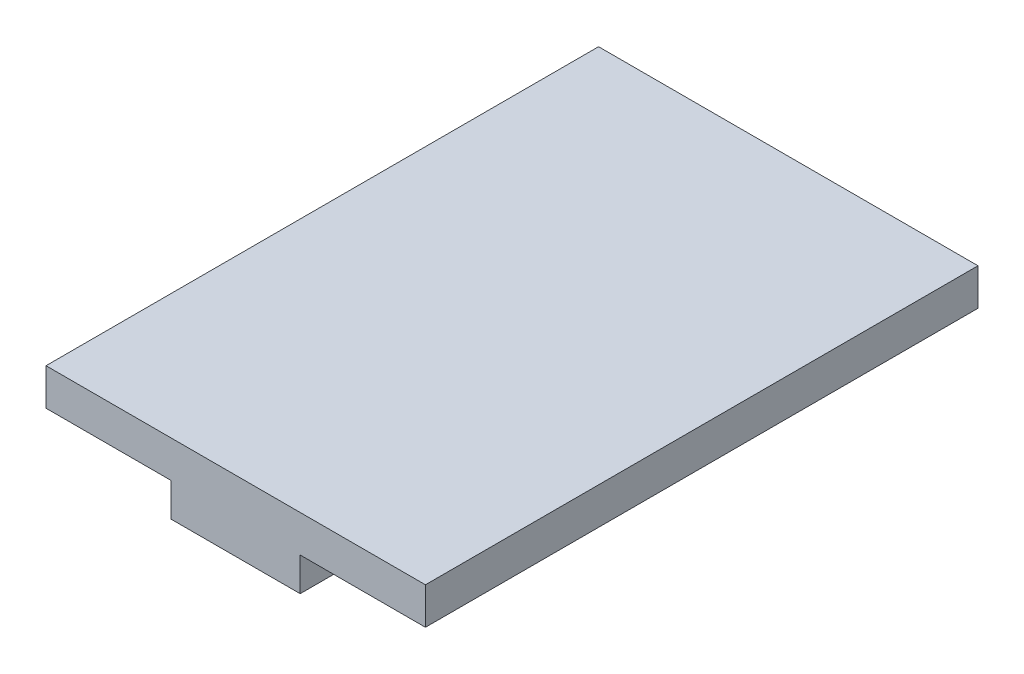
ISO-10303-21;
HEADER;
FILE_DESCRIPTION(('STEP AP214'),'2;1');
FILE_NAME('part.step','',(''),(''),'','','');
FILE_SCHEMA(('AUTOMOTIVE_DESIGN { 1 0 10303 214 1 1 1 1 }'));
ENDSEC;
DATA;
#1=APPLICATION_CONTEXT('core data for automotive mechanical design processes');
#2=APPLICATION_PROTOCOL_DEFINITION('international standard','automotive_design',2000,#1);
#3=PRODUCT_CONTEXT('',#1,'mechanical');
#4=PRODUCT('Part','Part','',(#3));
#5=PRODUCT_RELATED_PRODUCT_CATEGORY('part','',(#4));
#6=PRODUCT_DEFINITION_FORMATION('','',#4);
#7=PRODUCT_DEFINITION_CONTEXT('part definition',#1,'design');
#8=PRODUCT_DEFINITION('design','',#6,#7);
#9=PRODUCT_DEFINITION_SHAPE('','',#8);
#10=(LENGTH_UNIT() NAMED_UNIT(*) SI_UNIT(.MILLI.,.METRE.));
#11=(NAMED_UNIT(*) PLANE_ANGLE_UNIT() SI_UNIT($,.RADIAN.));
#12=(NAMED_UNIT(*) SI_UNIT($,.STERADIAN.) SOLID_ANGLE_UNIT());
#13=UNCERTAINTY_MEASURE_WITH_UNIT(LENGTH_MEASURE(1.E-05),#10,'distance_accuracy_value','');
#14=(GEOMETRIC_REPRESENTATION_CONTEXT(3) GLOBAL_UNCERTAINTY_ASSIGNED_CONTEXT((#13)) GLOBAL_UNIT_ASSIGNED_CONTEXT((#10,
#11,#12)) REPRESENTATION_CONTEXT('',''));
#15=CARTESIAN_POINT('',(0.,0.,0.));
#16=DIRECTION('',(0.,0.,1.));
#17=DIRECTION('',(1.,0.,0.));
#18=AXIS2_PLACEMENT_3D('',#15,#16,#17);
#19=CARTESIAN_POINT('',(-10.3,2.,-30.));
#20=DIRECTION('',(-1.,0.,0.));
#21=DIRECTION('',(0.,0.,1.));
#22=AXIS2_PLACEMENT_3D('',#19,#20,#21);
#23=PLANE('',#22);
#24=DIRECTION('',(0.,-1.,0.));
#25=VECTOR('',#24,1.);
#26=CARTESIAN_POINT('',(-10.3,2.,0.));
#27=LINE('',#26,#25);
#28=CARTESIAN_POINT('',(-10.3,2.,0.));
#29=VERTEX_POINT('',#28);
#30=CARTESIAN_POINT('',(-10.3,0.,0.));
#31=VERTEX_POINT('',#30);
#32=EDGE_CURVE('E138',#29,#31,#27,.T.);
#33=ORIENTED_EDGE('',*,*,#32,.F.);
#34=DIRECTION('',(0.,0.,1.));
#35=VECTOR('',#34,1.);
#36=CARTESIAN_POINT('',(-10.3,2.,-30.));
#37=LINE('',#36,#35);
#38=CARTESIAN_POINT('',(-10.3,2.,-30.));
#39=VERTEX_POINT('',#38);
#40=EDGE_CURVE('E11',#39,#29,#37,.T.);
#41=ORIENTED_EDGE('',*,*,#40,.F.);
#42=DIRECTION('',(0.,-1.,0.));
#43=VECTOR('',#42,1.);
#44=CARTESIAN_POINT('',(-10.3,2.,-30.));
#45=LINE('',#44,#43);
#46=CARTESIAN_POINT('',(-10.3,0.,-30.));
#47=VERTEX_POINT('',#46);
#48=EDGE_CURVE('E142',#39,#47,#45,.T.);
#49=ORIENTED_EDGE('',*,*,#48,.T.);
#50=DIRECTION('',(0.,0.,1.));
#51=VECTOR('',#50,1.);
#52=CARTESIAN_POINT('',(-10.3,0.,-30.));
#53=LINE('',#52,#51);
#54=EDGE_CURVE('E38',#47,#31,#53,.T.);
#55=ORIENTED_EDGE('',*,*,#54,.T.);
#56=EDGE_LOOP('',(#33,#41,#49,#55));
#57=FACE_BOUND('',#56,.T.);
#58=ADVANCED_FACE('F35',(#57),#23,.T.);
#59=CARTESIAN_POINT('',(-10.3,2.,-30.));
#60=DIRECTION('',(0.,1.,0.));
#61=DIRECTION('',(-1.,0.,0.));
#62=AXIS2_PLACEMENT_3D('',#59,#60,#61);
#63=PLANE('',#62);
#64=DIRECTION('',(-1.,0.,0.));
#65=VECTOR('',#64,1.);
#66=CARTESIAN_POINT('',(-10.3,2.,0.));
#67=LINE('',#66,#65);
#68=CARTESIAN_POINT('',(10.3,2.,0.));
#69=VERTEX_POINT('',#68);
#70=EDGE_CURVE('E145',#69,#29,#67,.T.);
#71=ORIENTED_EDGE('',*,*,#70,.F.);
#72=DIRECTION('',(0.,0.,1.));
#73=VECTOR('',#72,1.);
#74=CARTESIAN_POINT('',(10.3,2.,-30.));
#75=LINE('',#74,#73);
#76=CARTESIAN_POINT('',(10.3,2.,-30.));
#77=VERTEX_POINT('',#76);
#78=EDGE_CURVE('E43',#77,#69,#75,.T.);
#79=ORIENTED_EDGE('',*,*,#78,.F.);
#80=DIRECTION('',(-1.,0.,0.));
#81=VECTOR('',#80,1.);
#82=CARTESIAN_POINT('',(-10.3,2.,-30.));
#83=LINE('',#82,#81);
#84=EDGE_CURVE('E150',#77,#39,#83,.T.);
#85=ORIENTED_EDGE('',*,*,#84,.T.);
#86=ORIENTED_EDGE('',*,*,#40,.T.);
#87=EDGE_LOOP('',(#71,#79,#85,#86));
#88=FACE_BOUND('',#87,.T.);
#89=ADVANCED_FACE('F171',(#88),#63,.T.);
#90=CARTESIAN_POINT('',(10.3,2.,-30.));
#91=DIRECTION('',(1.,0.,0.));
#92=DIRECTION('',(0.,0.,-1.));
#93=AXIS2_PLACEMENT_3D('',#90,#91,#92);
#94=PLANE('',#93);
#95=DIRECTION('',(0.,1.,0.));
#96=VECTOR('',#95,1.);
#97=CARTESIAN_POINT('',(10.3,2.,0.));
#98=LINE('',#97,#96);
#99=CARTESIAN_POINT('',(10.3,0.,0.));
#100=VERTEX_POINT('',#99);
#101=EDGE_CURVE('E158',#100,#69,#98,.T.);
#102=ORIENTED_EDGE('',*,*,#101,.F.);
#103=DIRECTION('',(0.,0.,1.));
#104=VECTOR('',#103,1.);
#105=CARTESIAN_POINT('',(10.3,0.,-30.));
#106=LINE('',#105,#104);
#107=CARTESIAN_POINT('',(10.3,0.,-30.));
#108=VERTEX_POINT('',#107);
#109=EDGE_CURVE('E163',#108,#100,#106,.T.);
#110=ORIENTED_EDGE('',*,*,#109,.F.);
#111=DIRECTION('',(0.,1.,0.));
#112=VECTOR('',#111,1.);
#113=CARTESIAN_POINT('',(10.3,2.,-30.));
#114=LINE('',#113,#112);
#115=EDGE_CURVE('E147',#108,#77,#114,.T.);
#116=ORIENTED_EDGE('',*,*,#115,.T.);
#117=ORIENTED_EDGE('',*,*,#78,.T.);
#118=EDGE_LOOP('',(#102,#110,#116,#117));
#119=FACE_BOUND('',#118,.T.);
#120=ADVANCED_FACE('F175',(#119),#94,.T.);
#121=CARTESIAN_POINT('',(-10.3,0.,-30.));
#122=DIRECTION('',(0.,-1.,0.));
#123=DIRECTION('',(1.,0.,0.));
#124=AXIS2_PLACEMENT_3D('',#121,#122,#123);
#125=PLANE('',#124);
#126=DIRECTION('',(0.,0.,1.));
#127=VECTOR('',#126,1.);
#128=CARTESIAN_POINT('',(3.5,0.,-10.));
#129=LINE('',#128,#127);
#130=CARTESIAN_POINT('',(3.5,0.,-10.));
#131=VERTEX_POINT('',#130);
#132=CARTESIAN_POINT('',(3.5,0.,0.));
#133=VERTEX_POINT('',#132);
#134=EDGE_CURVE('E139',#131,#133,#129,.T.);
#135=ORIENTED_EDGE('',*,*,#134,.F.);
#136=DIRECTION('',(-1.,0.,0.));
#137=VECTOR('',#136,1.);
#138=CARTESIAN_POINT('',(-3.5,0.,-10.));
#139=LINE('',#138,#137);
#140=CARTESIAN_POINT('',(-3.5,0.,-10.));
#141=VERTEX_POINT('',#140);
#142=EDGE_CURVE('E115',#131,#141,#139,.T.);
#143=ORIENTED_EDGE('',*,*,#142,.T.);
#144=DIRECTION('',(0.,0.,1.));
#145=VECTOR('',#144,1.);
#146=CARTESIAN_POINT('',(-3.5,0.,-10.));
#147=LINE('',#146,#145);
#148=CARTESIAN_POINT('',(-3.5,0.,0.));
#149=VERTEX_POINT('',#148);
#150=EDGE_CURVE('E127',#141,#149,#147,.T.);
#151=ORIENTED_EDGE('',*,*,#150,.T.);
#152=DIRECTION('',(1.,0.,0.));
#153=VECTOR('',#152,1.);
#154=CARTESIAN_POINT('',(-10.3,0.,0.));
#155=LINE('',#154,#153);
#156=EDGE_CURVE('E155',#31,#149,#155,.T.);
#157=ORIENTED_EDGE('',*,*,#156,.F.);
#158=ORIENTED_EDGE('',*,*,#54,.F.);
#159=DIRECTION('',(1.,0.,0.));
#160=VECTOR('',#159,1.);
#161=CARTESIAN_POINT('',(-10.3,0.,-30.));
#162=LINE('',#161,#160);
#163=EDGE_CURVE('E144',#47,#108,#162,.T.);
#164=ORIENTED_EDGE('',*,*,#163,.T.);
#165=ORIENTED_EDGE('',*,*,#109,.T.);
#166=EDGE_CURVE('E154',#133,#100,#155,.T.);
#167=ORIENTED_EDGE('',*,*,#166,.F.);
#168=EDGE_LOOP('',(#135,#143,#151,#157,#158,#164,#165,#167));
#169=FACE_BOUND('',#168,.T.);
#170=ADVANCED_FACE('F168',(#169),#125,.T.);
#171=CARTESIAN_POINT('',(0.,0.,-30.));
#172=DIRECTION('',(0.,0.,1.));
#173=DIRECTION('',(1.,0.,0.));
#174=AXIS2_PLACEMENT_3D('',#171,#172,#173);
#175=PLANE('',#174);
#176=ORIENTED_EDGE('',*,*,#48,.F.);
#177=ORIENTED_EDGE('',*,*,#84,.F.);
#178=ORIENTED_EDGE('',*,*,#115,.F.);
#179=ORIENTED_EDGE('',*,*,#163,.F.);
#180=EDGE_LOOP('',(#176,#177,#178,#179));
#181=FACE_BOUND('',#180,.T.);
#182=ADVANCED_FACE('F177',(#181),#175,.F.);
#183=CARTESIAN_POINT('',(0.,0.,0.));
#184=DIRECTION('',(0.,0.,1.));
#185=DIRECTION('',(1.,0.,0.));
#186=AXIS2_PLACEMENT_3D('',#183,#184,#185);
#187=PLANE('',#186);
#188=ORIENTED_EDGE('',*,*,#32,.T.);
#189=ORIENTED_EDGE('',*,*,#156,.T.);
#190=DIRECTION('',(0.,-1.,0.));
#191=VECTOR('',#190,1.);
#192=CARTESIAN_POINT('',(-3.5,0.,0.));
#193=LINE('',#192,#191);
#194=CARTESIAN_POINT('',(-3.5,-1.82,0.));
#195=VERTEX_POINT('',#194);
#196=EDGE_CURVE('E51',#149,#195,#193,.T.);
#197=ORIENTED_EDGE('',*,*,#196,.T.);
#198=DIRECTION('',(1.,0.,0.));
#199=VECTOR('',#198,1.);
#200=CARTESIAN_POINT('',(-3.5,-1.82,0.));
#201=LINE('',#200,#199);
#202=CARTESIAN_POINT('',(3.5,-1.82,0.));
#203=VERTEX_POINT('',#202);
#204=EDGE_CURVE('E112',#195,#203,#201,.T.);
#205=ORIENTED_EDGE('',*,*,#204,.T.);
#206=DIRECTION('',(0.,1.,0.));
#207=VECTOR('',#206,1.);
#208=CARTESIAN_POINT('',(3.5,0.,0.));
#209=LINE('',#208,#207);
#210=EDGE_CURVE('E128',#203,#133,#209,.T.);
#211=ORIENTED_EDGE('',*,*,#210,.T.);
#212=ORIENTED_EDGE('',*,*,#166,.T.);
#213=ORIENTED_EDGE('',*,*,#101,.T.);
#214=ORIENTED_EDGE('',*,*,#70,.T.);
#215=EDGE_LOOP('',(#188,#189,#197,#205,#211,#212,#213,#214));
#216=FACE_BOUND('',#215,.T.);
#217=ADVANCED_FACE('F170',(#216),#187,.T.);
#218=CARTESIAN_POINT('',(-3.5,0.,-10.));
#219=DIRECTION('',(-1.,0.,0.));
#220=DIRECTION('',(0.,0.,1.));
#221=AXIS2_PLACEMENT_3D('',#218,#219,#220);
#222=PLANE('',#221);
#223=ORIENTED_EDGE('',*,*,#196,.F.);
#224=ORIENTED_EDGE('',*,*,#150,.F.);
#225=DIRECTION('',(0.,-1.,0.));
#226=VECTOR('',#225,1.);
#227=CARTESIAN_POINT('',(-3.5,0.,-10.));
#228=LINE('',#227,#226);
#229=CARTESIAN_POINT('',(-3.5,-1.82,-10.));
#230=VERTEX_POINT('',#229);
#231=EDGE_CURVE('E122',#141,#230,#228,.T.);
#232=ORIENTED_EDGE('',*,*,#231,.T.);
#233=DIRECTION('',(0.,0.,1.));
#234=VECTOR('',#233,1.);
#235=CARTESIAN_POINT('',(-3.5,-1.82,-10.));
#236=LINE('',#235,#234);
#237=EDGE_CURVE('E107',#230,#195,#236,.T.);
#238=ORIENTED_EDGE('',*,*,#237,.T.);
#239=EDGE_LOOP('',(#223,#224,#232,#238));
#240=FACE_BOUND('',#239,.T.);
#241=ADVANCED_FACE('F126',(#240),#222,.T.);
#242=CARTESIAN_POINT('',(3.5,0.,-10.));
#243=DIRECTION('',(1.,0.,0.));
#244=DIRECTION('',(0.,0.,-1.));
#245=AXIS2_PLACEMENT_3D('',#242,#243,#244);
#246=PLANE('',#245);
#247=ORIENTED_EDGE('',*,*,#210,.F.);
#248=DIRECTION('',(0.,0.,1.));
#249=VECTOR('',#248,1.);
#250=CARTESIAN_POINT('',(3.5,-1.82,-10.));
#251=LINE('',#250,#249);
#252=CARTESIAN_POINT('',(3.5,-1.82,-10.));
#253=VERTEX_POINT('',#252);
#254=EDGE_CURVE('E114',#253,#203,#251,.T.);
#255=ORIENTED_EDGE('',*,*,#254,.F.);
#256=DIRECTION('',(0.,1.,0.));
#257=VECTOR('',#256,1.);
#258=CARTESIAN_POINT('',(3.5,0.,-10.));
#259=LINE('',#258,#257);
#260=EDGE_CURVE('E124',#253,#131,#259,.T.);
#261=ORIENTED_EDGE('',*,*,#260,.T.);
#262=ORIENTED_EDGE('',*,*,#134,.T.);
#263=EDGE_LOOP('',(#247,#255,#261,#262));
#264=FACE_BOUND('',#263,.T.);
#265=ADVANCED_FACE('F219',(#264),#246,.T.);
#266=CARTESIAN_POINT('',(-3.5,-1.82,-10.));
#267=DIRECTION('',(0.,-1.,0.));
#268=DIRECTION('',(1.,0.,0.));
#269=AXIS2_PLACEMENT_3D('',#266,#267,#268);
#270=PLANE('',#269);
#271=ORIENTED_EDGE('',*,*,#204,.F.);
#272=ORIENTED_EDGE('',*,*,#237,.F.);
#273=DIRECTION('',(1.,0.,0.));
#274=VECTOR('',#273,1.);
#275=CARTESIAN_POINT('',(-3.5,-1.82,-10.));
#276=LINE('',#275,#274);
#277=EDGE_CURVE('E110',#230,#253,#276,.T.);
#278=ORIENTED_EDGE('',*,*,#277,.T.);
#279=ORIENTED_EDGE('',*,*,#254,.T.);
#280=EDGE_LOOP('',(#271,#272,#278,#279));
#281=FACE_BOUND('',#280,.T.);
#282=ADVANCED_FACE('F109',(#281),#270,.T.);
#283=CARTESIAN_POINT('',(0.,0.,-10.));
#284=DIRECTION('',(0.,0.,1.));
#285=DIRECTION('',(1.,0.,0.));
#286=AXIS2_PLACEMENT_3D('',#283,#284,#285);
#287=PLANE('',#286);
#288=ORIENTED_EDGE('',*,*,#231,.F.);
#289=ORIENTED_EDGE('',*,*,#142,.F.);
#290=ORIENTED_EDGE('',*,*,#260,.F.);
#291=ORIENTED_EDGE('',*,*,#277,.F.);
#292=EDGE_LOOP('',(#288,#289,#290,#291));
#293=FACE_BOUND('',#292,.T.);
#294=ADVANCED_FACE('F120',(#293),#287,.F.);
#295=CLOSED_SHELL('',(#58,#89,#120,#170,#182,#217,#241,#265,#282,#294));
#296=MANIFOLD_SOLID_BREP('B2',#295);
#297=ADVANCED_BREP_SHAPE_REPRESENTATION('',(#18,#296),#14);
#298=SHAPE_DEFINITION_REPRESENTATION(#9,#297);
ENDSEC;
END-ISO-10303-21;
